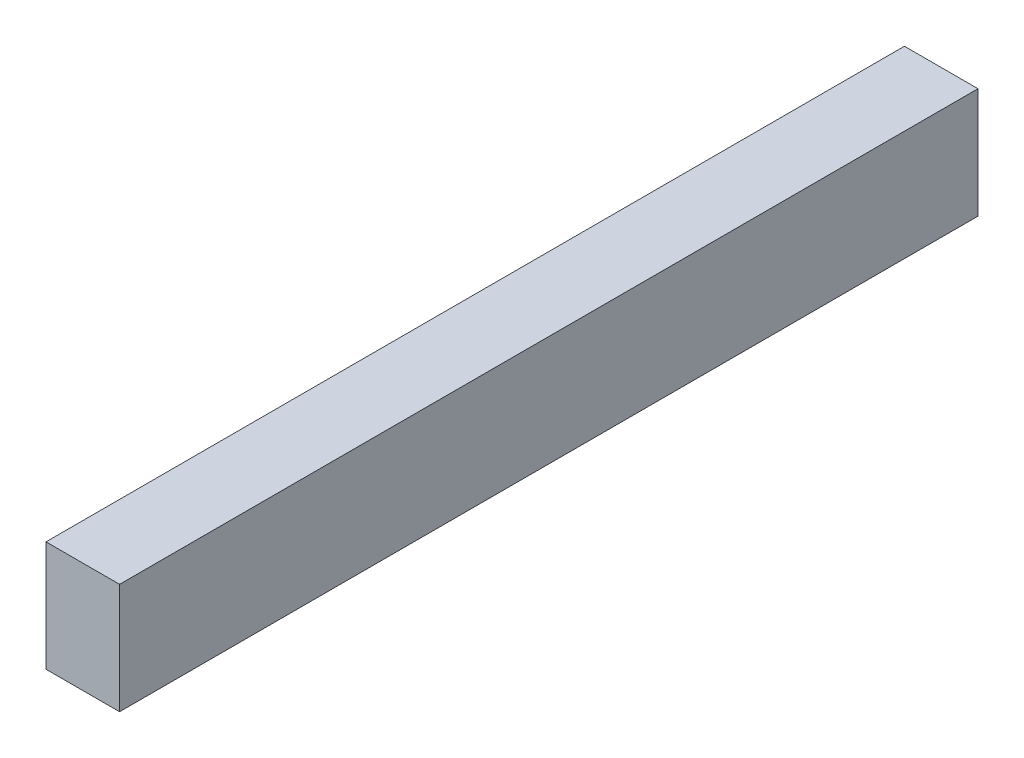
ISO-10303-21;
HEADER;
FILE_DESCRIPTION(('STEP AP214'),'2;1');
FILE_NAME('part.step','',(''),(''),'','','');
FILE_SCHEMA(('AUTOMOTIVE_DESIGN { 1 0 10303 214 1 1 1 1 }'));
ENDSEC;
DATA;
#1=APPLICATION_CONTEXT('core data for automotive mechanical design processes');
#2=APPLICATION_PROTOCOL_DEFINITION('international standard','automotive_design',2000,#1);
#3=PRODUCT_CONTEXT('',#1,'mechanical');
#4=PRODUCT('Part','Part','',(#3));
#5=PRODUCT_RELATED_PRODUCT_CATEGORY('part','',(#4));
#6=PRODUCT_DEFINITION_FORMATION('','',#4);
#7=PRODUCT_DEFINITION_CONTEXT('part definition',#1,'design');
#8=PRODUCT_DEFINITION('design','',#6,#7);
#9=PRODUCT_DEFINITION_SHAPE('','',#8);
#10=(LENGTH_UNIT() NAMED_UNIT(*) SI_UNIT(.MILLI.,.METRE.));
#11=(NAMED_UNIT(*) PLANE_ANGLE_UNIT() SI_UNIT($,.RADIAN.));
#12=(NAMED_UNIT(*) SI_UNIT($,.STERADIAN.) SOLID_ANGLE_UNIT());
#13=UNCERTAINTY_MEASURE_WITH_UNIT(LENGTH_MEASURE(1.E-05),#10,'distance_accuracy_value','');
#14=(GEOMETRIC_REPRESENTATION_CONTEXT(3) GLOBAL_UNCERTAINTY_ASSIGNED_CONTEXT((#13)) GLOBAL_UNIT_ASSIGNED_CONTEXT((#10,
#11,#12)) REPRESENTATION_CONTEXT('',''));
#15=CARTESIAN_POINT('',(0.,0.,0.));
#16=DIRECTION('',(0.,0.,1.));
#17=DIRECTION('',(1.,0.,0.));
#18=AXIS2_PLACEMENT_3D('',#15,#16,#17);
#19=CARTESIAN_POINT('',(-22.3448275862069,27.,-24.9605911330049));
#20=DIRECTION('',(1.,0.,0.));
#21=DIRECTION('',(0.,0.,-1.));
#22=AXIS2_PLACEMENT_3D('',#19,#20,#21);
#23=PLANE('',#22);
#24=DIRECTION('',(0.,0.,1.));
#25=VECTOR('',#24,1.);
#26=CARTESIAN_POINT('',(-22.3448275862069,0.,-24.9605911330049));
#27=LINE('',#26,#25);
#28=CARTESIAN_POINT('',(-22.3448275862069,0.,-24.9605911330049));
#29=VERTEX_POINT('',#28);
#30=CARTESIAN_POINT('',(-22.3448275862069,0.,185.039408866995));
#31=VERTEX_POINT('',#30);
#32=EDGE_CURVE('E102',#29,#31,#27,.T.);
#33=ORIENTED_EDGE('',*,*,#32,.T.);
#34=DIRECTION('',(0.,-1.,0.));
#35=VECTOR('',#34,1.);
#36=CARTESIAN_POINT('',(-22.3448275862069,27.,185.039408866995));
#37=LINE('',#36,#35);
#38=CARTESIAN_POINT('',(-22.3448275862069,27.,185.039408866995));
#39=VERTEX_POINT('',#38);
#40=EDGE_CURVE('E11',#39,#31,#37,.T.);
#41=ORIENTED_EDGE('',*,*,#40,.F.);
#42=DIRECTION('',(0.,0.,1.));
#43=VECTOR('',#42,1.);
#44=CARTESIAN_POINT('',(-22.3448275862069,27.,-24.9605911330049));
#45=LINE('',#44,#43);
#46=CARTESIAN_POINT('',(-22.3448275862069,27.,-24.9605911330049));
#47=VERTEX_POINT('',#46);
#48=EDGE_CURVE('E90',#47,#39,#45,.T.);
#49=ORIENTED_EDGE('',*,*,#48,.F.);
#50=DIRECTION('',(0.,-1.,0.));
#51=VECTOR('',#50,1.);
#52=CARTESIAN_POINT('',(-22.3448275862069,27.,-24.9605911330049));
#53=LINE('',#52,#51);
#54=EDGE_CURVE('E98',#47,#29,#53,.T.);
#55=ORIENTED_EDGE('',*,*,#54,.T.);
#56=EDGE_LOOP('',(#33,#41,#49,#55));
#57=FACE_BOUND('',#56,.T.);
#58=ADVANCED_FACE('F39',(#57),#23,.F.);
#59=CARTESIAN_POINT('',(-22.3448275862069,27.,185.039408866995));
#60=DIRECTION('',(0.,0.,-1.));
#61=DIRECTION('',(-1.,0.,0.));
#62=AXIS2_PLACEMENT_3D('',#59,#60,#61);
#63=PLANE('',#62);
#64=DIRECTION('',(1.,0.,0.));
#65=VECTOR('',#64,1.);
#66=CARTESIAN_POINT('',(-22.3448275862069,0.,185.039408866995));
#67=LINE('',#66,#65);
#68=CARTESIAN_POINT('',(-4.34482758620687,0.,185.039408866995));
#69=VERTEX_POINT('',#68);
#70=EDGE_CURVE('E94',#31,#69,#67,.T.);
#71=ORIENTED_EDGE('',*,*,#70,.T.);
#72=DIRECTION('',(0.,-1.,0.));
#73=VECTOR('',#72,1.);
#74=CARTESIAN_POINT('',(-4.34482758620687,27.,185.039408866995));
#75=LINE('',#74,#73);
#76=CARTESIAN_POINT('',(-4.34482758620687,27.,185.039408866995));
#77=VERTEX_POINT('',#76);
#78=EDGE_CURVE('E47',#77,#69,#75,.T.);
#79=ORIENTED_EDGE('',*,*,#78,.F.);
#80=DIRECTION('',(1.,0.,0.));
#81=VECTOR('',#80,1.);
#82=CARTESIAN_POINT('',(-22.3448275862069,27.,185.039408866995));
#83=LINE('',#82,#81);
#84=EDGE_CURVE('E85',#39,#77,#83,.T.);
#85=ORIENTED_EDGE('',*,*,#84,.F.);
#86=ORIENTED_EDGE('',*,*,#40,.T.);
#87=EDGE_LOOP('',(#71,#79,#85,#86));
#88=FACE_BOUND('',#87,.T.);
#89=ADVANCED_FACE('F93',(#88),#63,.F.);
#90=CARTESIAN_POINT('',(-4.34482758620689,27.,-24.9605911330049));
#91=DIRECTION('',(-1.,0.,0.));
#92=DIRECTION('',(0.,0.,1.));
#93=AXIS2_PLACEMENT_3D('',#90,#91,#92);
#94=PLANE('',#93);
#95=DIRECTION('',(0.,0.,-1.));
#96=VECTOR('',#95,1.);
#97=CARTESIAN_POINT('',(-4.34482758620689,0.,-24.9605911330049));
#98=LINE('',#97,#96);
#99=CARTESIAN_POINT('',(-4.34482758620689,0.,-24.9605911330049));
#100=VERTEX_POINT('',#99);
#101=EDGE_CURVE('E72',#69,#100,#98,.T.);
#102=ORIENTED_EDGE('',*,*,#101,.T.);
#103=DIRECTION('',(0.,-1.,0.));
#104=VECTOR('',#103,1.);
#105=CARTESIAN_POINT('',(-4.34482758620689,27.,-24.9605911330049));
#106=LINE('',#105,#104);
#107=CARTESIAN_POINT('',(-4.34482758620689,27.,-24.9605911330049));
#108=VERTEX_POINT('',#107);
#109=EDGE_CURVE('E95',#108,#100,#106,.T.);
#110=ORIENTED_EDGE('',*,*,#109,.F.);
#111=DIRECTION('',(0.,0.,-1.));
#112=VECTOR('',#111,1.);
#113=CARTESIAN_POINT('',(-4.34482758620689,27.,-24.9605911330049));
#114=LINE('',#113,#112);
#115=EDGE_CURVE('E88',#77,#108,#114,.T.);
#116=ORIENTED_EDGE('',*,*,#115,.F.);
#117=ORIENTED_EDGE('',*,*,#78,.T.);
#118=EDGE_LOOP('',(#102,#110,#116,#117));
#119=FACE_BOUND('',#118,.T.);
#120=ADVANCED_FACE('F96',(#119),#94,.F.);
#121=CARTESIAN_POINT('',(-22.3448275862069,27.,-24.9605911330049));
#122=DIRECTION('',(0.,0.,1.));
#123=DIRECTION('',(1.,0.,0.));
#124=AXIS2_PLACEMENT_3D('',#121,#122,#123);
#125=PLANE('',#124);
#126=DIRECTION('',(-1.,0.,0.));
#127=VECTOR('',#126,1.);
#128=CARTESIAN_POINT('',(-22.3448275862069,0.,-24.9605911330049));
#129=LINE('',#128,#127);
#130=EDGE_CURVE('E78',#100,#29,#129,.T.);
#131=ORIENTED_EDGE('',*,*,#130,.T.);
#132=ORIENTED_EDGE('',*,*,#54,.F.);
#133=DIRECTION('',(-1.,0.,0.));
#134=VECTOR('',#133,1.);
#135=CARTESIAN_POINT('',(-22.3448275862069,27.,-24.9605911330049));
#136=LINE('',#135,#134);
#137=EDGE_CURVE('E55',#108,#47,#136,.T.);
#138=ORIENTED_EDGE('',*,*,#137,.F.);
#139=ORIENTED_EDGE('',*,*,#109,.T.);
#140=EDGE_LOOP('',(#131,#132,#138,#139));
#141=FACE_BOUND('',#140,.T.);
#142=ADVANCED_FACE('F109',(#141),#125,.F.);
#143=CARTESIAN_POINT('',(0.,27.,0.));
#144=DIRECTION('',(0.,1.,0.));
#145=DIRECTION('',(0.,0.,1.));
#146=AXIS2_PLACEMENT_3D('',#143,#144,#145);
#147=PLANE('',#146);
#148=ORIENTED_EDGE('',*,*,#48,.T.);
#149=ORIENTED_EDGE('',*,*,#84,.T.);
#150=ORIENTED_EDGE('',*,*,#115,.T.);
#151=ORIENTED_EDGE('',*,*,#137,.T.);
#152=EDGE_LOOP('',(#148,#149,#150,#151));
#153=FACE_BOUND('',#152,.T.);
#154=ADVANCED_FACE('F86',(#153),#147,.T.);
#155=CARTESIAN_POINT('',(0.,0.,0.));
#156=DIRECTION('',(0.,1.,0.));
#157=DIRECTION('',(0.,0.,1.));
#158=AXIS2_PLACEMENT_3D('',#155,#156,#157);
#159=PLANE('',#158);
#160=ORIENTED_EDGE('',*,*,#32,.F.);
#161=ORIENTED_EDGE('',*,*,#130,.F.);
#162=ORIENTED_EDGE('',*,*,#101,.F.);
#163=ORIENTED_EDGE('',*,*,#70,.F.);
#164=EDGE_LOOP('',(#160,#161,#162,#163));
#165=FACE_BOUND('',#164,.T.);
#166=ADVANCED_FACE('F112',(#165),#159,.F.);
#167=CLOSED_SHELL('',(#58,#89,#120,#142,#154,#166));
#168=MANIFOLD_SOLID_BREP('B2',#167);
#169=ADVANCED_BREP_SHAPE_REPRESENTATION('',(#18,#168),#14);
#170=SHAPE_DEFINITION_REPRESENTATION(#9,#169);
ENDSEC;
END-ISO-10303-21;
